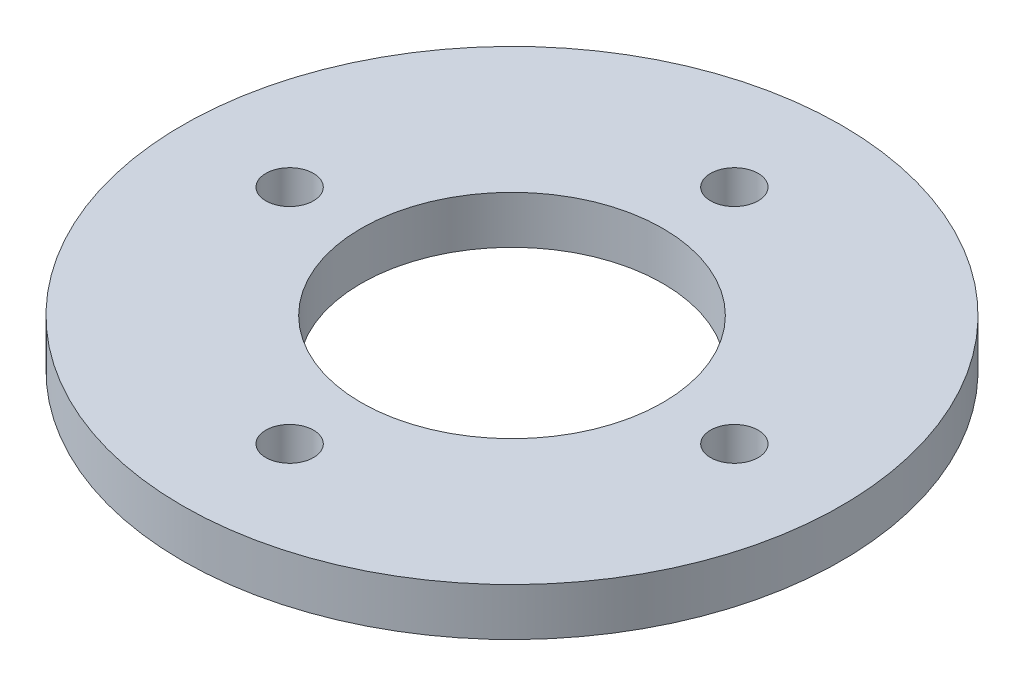
ISO-10303-21;
HEADER;
FILE_DESCRIPTION(('STEP AP214'),'2;1');
FILE_NAME('part.step','',(''),(''),'','','');
FILE_SCHEMA(('AUTOMOTIVE_DESIGN { 1 0 10303 214 1 1 1 1 }'));
ENDSEC;
DATA;
#1=APPLICATION_CONTEXT('core data for automotive mechanical design processes');
#2=APPLICATION_PROTOCOL_DEFINITION('international standard','automotive_design',2000,#1);
#3=PRODUCT_CONTEXT('',#1,'mechanical');
#4=PRODUCT('Part','Part','',(#3));
#5=PRODUCT_RELATED_PRODUCT_CATEGORY('part','',(#4));
#6=PRODUCT_DEFINITION_FORMATION('','',#4);
#7=PRODUCT_DEFINITION_CONTEXT('part definition',#1,'design');
#8=PRODUCT_DEFINITION('design','',#6,#7);
#9=PRODUCT_DEFINITION_SHAPE('','',#8);
#10=(LENGTH_UNIT() NAMED_UNIT(*) SI_UNIT(.MILLI.,.METRE.));
#11=(NAMED_UNIT(*) PLANE_ANGLE_UNIT() SI_UNIT($,.RADIAN.));
#12=(NAMED_UNIT(*) SI_UNIT($,.STERADIAN.) SOLID_ANGLE_UNIT());
#13=UNCERTAINTY_MEASURE_WITH_UNIT(LENGTH_MEASURE(1.E-05),#10,'distance_accuracy_value','');
#14=(GEOMETRIC_REPRESENTATION_CONTEXT(3) GLOBAL_UNCERTAINTY_ASSIGNED_CONTEXT((#13)) GLOBAL_UNIT_ASSIGNED_CONTEXT((#10,
#11,#12)) REPRESENTATION_CONTEXT('',''));
#15=CARTESIAN_POINT('',(0.,0.,0.));
#16=DIRECTION('',(0.,0.,1.));
#17=DIRECTION('',(1.,0.,0.));
#18=AXIS2_PLACEMENT_3D('',#15,#16,#17);
#19=CARTESIAN_POINT('',(0.,3.,0.));
#20=DIRECTION('',(0.,-1.,0.));
#21=DIRECTION('',(0.,0.,-1.));
#22=AXIS2_PLACEMENT_3D('',#19,#20,#21);
#23=CYLINDRICAL_SURFACE('',#22,9.5);
#24=CARTESIAN_POINT('',(0.,3.,0.));
#25=DIRECTION('',(0.,1.,0.));
#26=DIRECTION('',(0.,0.,1.));
#27=AXIS2_PLACEMENT_3D('',#24,#25,#26);
#28=CIRCLE('',#27,9.5);
#29=CARTESIAN_POINT('',(0.,3.,9.5));
#30=VERTEX_POINT('',#29);
#31=EDGE_CURVE('E47',#30,#30,#28,.T.);
#32=ORIENTED_EDGE('',*,*,#31,.T.);
#33=EDGE_LOOP('',(#32));
#34=FACE_BOUND('',#33,.T.);
#35=CARTESIAN_POINT('',(0.,0.,0.));
#36=DIRECTION('',(0.,1.,0.));
#37=DIRECTION('',(0.,0.,1.));
#38=AXIS2_PLACEMENT_3D('',#35,#36,#37);
#39=CIRCLE('',#38,9.5);
#40=CARTESIAN_POINT('',(0.,0.,9.5));
#41=VERTEX_POINT('',#40);
#42=EDGE_CURVE('E67',#41,#41,#39,.T.);
#43=ORIENTED_EDGE('',*,*,#42,.F.);
#44=EDGE_LOOP('',(#43));
#45=FACE_BOUND('',#44,.T.);
#46=ADVANCED_FACE('F41',(#34,#45),#23,.F.);
#47=CARTESIAN_POINT('',(14.,3.,0.));
#48=DIRECTION('',(0.,-1.,0.));
#49=DIRECTION('',(0.,0.,-1.));
#50=AXIS2_PLACEMENT_3D('',#47,#48,#49);
#51=CYLINDRICAL_SURFACE('',#50,1.5);
#52=CARTESIAN_POINT('',(14.,3.,0.));
#53=DIRECTION('',(0.,1.,0.));
#54=DIRECTION('',(0.,0.,1.));
#55=AXIS2_PLACEMENT_3D('',#52,#53,#54);
#56=CIRCLE('',#55,1.5);
#57=CARTESIAN_POINT('',(14.,3.,1.5));
#58=VERTEX_POINT('',#57);
#59=EDGE_CURVE('E53',#58,#58,#56,.T.);
#60=ORIENTED_EDGE('',*,*,#59,.T.);
#61=EDGE_LOOP('',(#60));
#62=FACE_BOUND('',#61,.T.);
#63=CARTESIAN_POINT('',(14.,0.,0.));
#64=DIRECTION('',(0.,1.,0.));
#65=DIRECTION('',(0.,0.,1.));
#66=AXIS2_PLACEMENT_3D('',#63,#64,#65);
#67=CIRCLE('',#66,1.5);
#68=CARTESIAN_POINT('',(14.,0.,1.5));
#69=VERTEX_POINT('',#68);
#70=EDGE_CURVE('E70',#69,#69,#67,.T.);
#71=ORIENTED_EDGE('',*,*,#70,.F.);
#72=EDGE_LOOP('',(#71));
#73=FACE_BOUND('',#72,.T.);
#74=ADVANCED_FACE('F89',(#62,#73),#51,.F.);
#75=CARTESIAN_POINT('',(0.,3.,14.));
#76=DIRECTION('',(0.,-1.,0.));
#77=DIRECTION('',(0.,0.,-1.));
#78=AXIS2_PLACEMENT_3D('',#75,#76,#77);
#79=CYLINDRICAL_SURFACE('',#78,1.5);
#80=CARTESIAN_POINT('',(0.,3.,14.));
#81=DIRECTION('',(0.,1.,0.));
#82=DIRECTION('',(0.,0.,1.));
#83=AXIS2_PLACEMENT_3D('',#80,#81,#82);
#84=CIRCLE('',#83,1.5);
#85=CARTESIAN_POINT('',(0.,3.,15.5));
#86=VERTEX_POINT('',#85);
#87=EDGE_CURVE('E83',#86,#86,#84,.T.);
#88=ORIENTED_EDGE('',*,*,#87,.T.);
#89=EDGE_LOOP('',(#88));
#90=FACE_BOUND('',#89,.T.);
#91=CARTESIAN_POINT('',(0.,0.,14.));
#92=DIRECTION('',(0.,1.,0.));
#93=DIRECTION('',(0.,0.,1.));
#94=AXIS2_PLACEMENT_3D('',#91,#92,#93);
#95=CIRCLE('',#94,1.5);
#96=CARTESIAN_POINT('',(0.,0.,15.5));
#97=VERTEX_POINT('',#96);
#98=EDGE_CURVE('E63',#97,#97,#95,.T.);
#99=ORIENTED_EDGE('',*,*,#98,.F.);
#100=EDGE_LOOP('',(#99));
#101=FACE_BOUND('',#100,.T.);
#102=ADVANCED_FACE('F107',(#90,#101),#79,.F.);
#103=CARTESIAN_POINT('',(-14.,3.,0.));
#104=DIRECTION('',(0.,-1.,0.));
#105=DIRECTION('',(0.,0.,-1.));
#106=AXIS2_PLACEMENT_3D('',#103,#104,#105);
#107=CYLINDRICAL_SURFACE('',#106,1.5);
#108=CARTESIAN_POINT('',(-14.,3.,0.));
#109=DIRECTION('',(0.,1.,0.));
#110=DIRECTION('',(0.,0.,1.));
#111=AXIS2_PLACEMENT_3D('',#108,#109,#110);
#112=CIRCLE('',#111,1.5);
#113=CARTESIAN_POINT('',(-14.,3.,1.5));
#114=VERTEX_POINT('',#113);
#115=EDGE_CURVE('E79',#114,#114,#112,.T.);
#116=ORIENTED_EDGE('',*,*,#115,.T.);
#117=EDGE_LOOP('',(#116));
#118=FACE_BOUND('',#117,.T.);
#119=CARTESIAN_POINT('',(-14.,0.,0.));
#120=DIRECTION('',(0.,1.,0.));
#121=DIRECTION('',(0.,0.,1.));
#122=AXIS2_PLACEMENT_3D('',#119,#120,#121);
#123=CIRCLE('',#122,1.5);
#124=CARTESIAN_POINT('',(-14.,0.,1.5));
#125=VERTEX_POINT('',#124);
#126=EDGE_CURVE('E61',#125,#125,#123,.T.);
#127=ORIENTED_EDGE('',*,*,#126,.F.);
#128=EDGE_LOOP('',(#127));
#129=FACE_BOUND('',#128,.T.);
#130=ADVANCED_FACE('F111',(#118,#129),#107,.F.);
#131=CARTESIAN_POINT('',(0.,3.,-14.));
#132=DIRECTION('',(0.,-1.,0.));
#133=DIRECTION('',(0.,0.,-1.));
#134=AXIS2_PLACEMENT_3D('',#131,#132,#133);
#135=CYLINDRICAL_SURFACE('',#134,1.5);
#136=CARTESIAN_POINT('',(0.,3.,-14.));
#137=DIRECTION('',(0.,1.,0.));
#138=DIRECTION('',(0.,0.,1.));
#139=AXIS2_PLACEMENT_3D('',#136,#137,#138);
#140=CIRCLE('',#139,1.5);
#141=CARTESIAN_POINT('',(0.,3.,-12.5));
#142=VERTEX_POINT('',#141);
#143=EDGE_CURVE('E74',#142,#142,#140,.T.);
#144=ORIENTED_EDGE('',*,*,#143,.T.);
#145=EDGE_LOOP('',(#144));
#146=FACE_BOUND('',#145,.T.);
#147=CARTESIAN_POINT('',(0.,0.,-14.));
#148=DIRECTION('',(0.,1.,0.));
#149=DIRECTION('',(0.,0.,1.));
#150=AXIS2_PLACEMENT_3D('',#147,#148,#149);
#151=CIRCLE('',#150,1.5);
#152=CARTESIAN_POINT('',(0.,0.,-12.5));
#153=VERTEX_POINT('',#152);
#154=EDGE_CURVE('E59',#153,#153,#151,.T.);
#155=ORIENTED_EDGE('',*,*,#154,.F.);
#156=EDGE_LOOP('',(#155));
#157=FACE_BOUND('',#156,.T.);
#158=ADVANCED_FACE('F43',(#146,#157),#135,.F.);
#159=CARTESIAN_POINT('',(0.,3.,0.));
#160=DIRECTION('',(0.,-1.,0.));
#161=DIRECTION('',(0.,0.,-1.));
#162=AXIS2_PLACEMENT_3D('',#159,#160,#161);
#163=CYLINDRICAL_SURFACE('',#162,20.75);
#164=CARTESIAN_POINT('',(0.,3.,0.));
#165=DIRECTION('',(0.,1.,0.));
#166=DIRECTION('',(0.,0.,1.));
#167=AXIS2_PLACEMENT_3D('',#164,#165,#166);
#168=CIRCLE('',#167,20.75);
#169=CARTESIAN_POINT('',(0.,3.,20.75));
#170=VERTEX_POINT('',#169);
#171=EDGE_CURVE('E10',#170,#170,#168,.T.);
#172=ORIENTED_EDGE('',*,*,#171,.F.);
#173=EDGE_LOOP('',(#172));
#174=FACE_BOUND('',#173,.T.);
#175=CARTESIAN_POINT('',(0.,0.,0.));
#176=DIRECTION('',(0.,1.,0.));
#177=DIRECTION('',(0.,0.,1.));
#178=AXIS2_PLACEMENT_3D('',#175,#176,#177);
#179=CIRCLE('',#178,20.75);
#180=CARTESIAN_POINT('',(0.,0.,20.75));
#181=VERTEX_POINT('',#180);
#182=EDGE_CURVE('E44',#181,#181,#179,.T.);
#183=ORIENTED_EDGE('',*,*,#182,.T.);
#184=EDGE_LOOP('',(#183));
#185=FACE_BOUND('',#184,.T.);
#186=ADVANCED_FACE('F100',(#174,#185),#163,.T.);
#187=CARTESIAN_POINT('',(0.,3.,0.));
#188=DIRECTION('',(0.,1.,0.));
#189=DIRECTION('',(0.,0.,1.));
#190=AXIS2_PLACEMENT_3D('',#187,#188,#189);
#191=PLANE('',#190);
#192=ORIENTED_EDGE('',*,*,#143,.F.);
#193=EDGE_LOOP('',(#192));
#194=FACE_BOUND('',#193,.T.);
#195=ORIENTED_EDGE('',*,*,#115,.F.);
#196=EDGE_LOOP('',(#195));
#197=FACE_BOUND('',#196,.T.);
#198=ORIENTED_EDGE('',*,*,#87,.F.);
#199=EDGE_LOOP('',(#198));
#200=FACE_BOUND('',#199,.T.);
#201=ORIENTED_EDGE('',*,*,#59,.F.);
#202=EDGE_LOOP('',(#201));
#203=FACE_BOUND('',#202,.T.);
#204=ORIENTED_EDGE('',*,*,#31,.F.);
#205=EDGE_LOOP('',(#204));
#206=FACE_BOUND('',#205,.T.);
#207=ORIENTED_EDGE('',*,*,#171,.T.);
#208=EDGE_LOOP('',(#207));
#209=FACE_BOUND('',#208,.T.);
#210=ADVANCED_FACE('F91',(#194,#197,#200,#203,#206,#209),#191,.T.);
#211=CARTESIAN_POINT('',(0.,0.,0.));
#212=DIRECTION('',(0.,1.,0.));
#213=DIRECTION('',(0.,0.,1.));
#214=AXIS2_PLACEMENT_3D('',#211,#212,#213);
#215=PLANE('',#214);
#216=ORIENTED_EDGE('',*,*,#154,.T.);
#217=EDGE_LOOP('',(#216));
#218=FACE_BOUND('',#217,.T.);
#219=ORIENTED_EDGE('',*,*,#126,.T.);
#220=EDGE_LOOP('',(#219));
#221=FACE_BOUND('',#220,.T.);
#222=ORIENTED_EDGE('',*,*,#98,.T.);
#223=EDGE_LOOP('',(#222));
#224=FACE_BOUND('',#223,.T.);
#225=ORIENTED_EDGE('',*,*,#70,.T.);
#226=EDGE_LOOP('',(#225));
#227=FACE_BOUND('',#226,.T.);
#228=ORIENTED_EDGE('',*,*,#42,.T.);
#229=EDGE_LOOP('',(#228));
#230=FACE_BOUND('',#229,.T.);
#231=ORIENTED_EDGE('',*,*,#182,.F.);
#232=EDGE_LOOP('',(#231));
#233=FACE_BOUND('',#232,.T.);
#234=ADVANCED_FACE('F96',(#218,#221,#224,#227,#230,#233),#215,.F.);
#235=CLOSED_SHELL('',(#46,#74,#102,#130,#158,#186,#210,#234));
#236=MANIFOLD_SOLID_BREP('B2',#235);
#237=ADVANCED_BREP_SHAPE_REPRESENTATION('',(#18,#236),#14);
#238=SHAPE_DEFINITION_REPRESENTATION(#9,#237);
ENDSEC;
END-ISO-10303-21;
